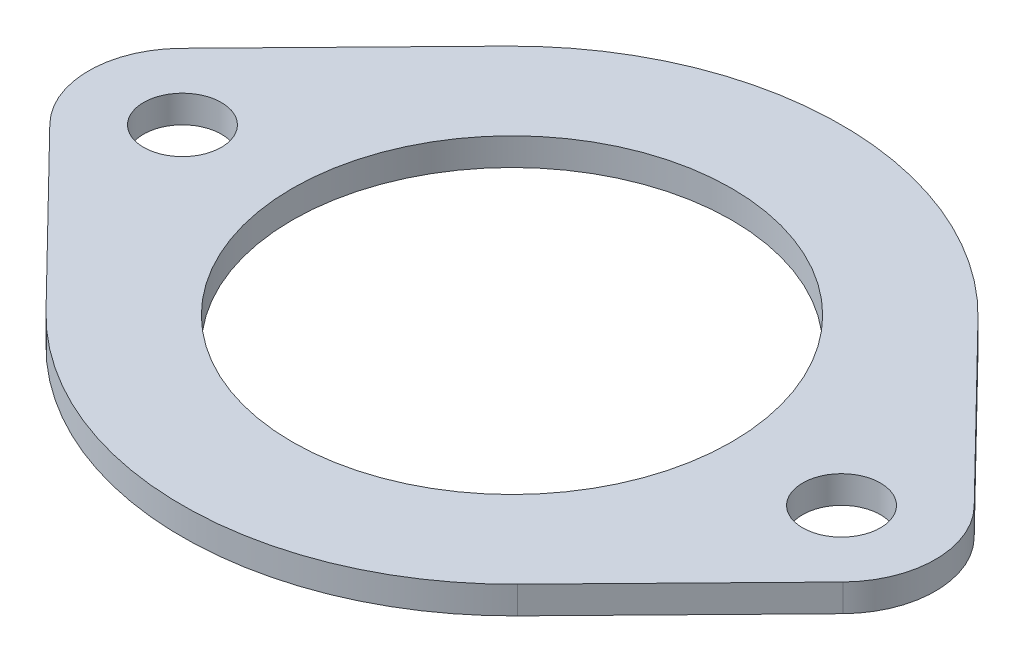
ISO-10303-21;
HEADER;
FILE_DESCRIPTION(('STEP AP214'),'2;1');
FILE_NAME('part.step','',(''),(''),'','','');
FILE_SCHEMA(('AUTOMOTIVE_DESIGN { 1 0 10303 214 1 1 1 1 }'));
ENDSEC;
DATA;
#1=APPLICATION_CONTEXT('core data for automotive mechanical design processes');
#2=APPLICATION_PROTOCOL_DEFINITION('international standard','automotive_design',2000,#1);
#3=PRODUCT_CONTEXT('',#1,'mechanical');
#4=PRODUCT('Part','Part','',(#3));
#5=PRODUCT_RELATED_PRODUCT_CATEGORY('part','',(#4));
#6=PRODUCT_DEFINITION_FORMATION('','',#4);
#7=PRODUCT_DEFINITION_CONTEXT('part definition',#1,'design');
#8=PRODUCT_DEFINITION('design','',#6,#7);
#9=PRODUCT_DEFINITION_SHAPE('','',#8);
#10=(LENGTH_UNIT() NAMED_UNIT(*) SI_UNIT(.MILLI.,.METRE.));
#11=(NAMED_UNIT(*) PLANE_ANGLE_UNIT() SI_UNIT($,.RADIAN.));
#12=(NAMED_UNIT(*) SI_UNIT($,.STERADIAN.) SOLID_ANGLE_UNIT());
#13=UNCERTAINTY_MEASURE_WITH_UNIT(LENGTH_MEASURE(1.E-05),#10,'distance_accuracy_value','');
#14=(GEOMETRIC_REPRESENTATION_CONTEXT(3) GLOBAL_UNCERTAINTY_ASSIGNED_CONTEXT((#13)) GLOBAL_UNIT_ASSIGNED_CONTEXT((#10,
#11,#12)) REPRESENTATION_CONTEXT('',''));
#15=CARTESIAN_POINT('',(0.,0.,0.));
#16=DIRECTION('',(0.,0.,1.));
#17=DIRECTION('',(1.,0.,0.));
#18=AXIS2_PLACEMENT_3D('',#15,#16,#17);
#19=CARTESIAN_POINT('',(-19.05,1.5875,0.));
#20=DIRECTION('',(0.,1.,0.));
#21=DIRECTION('',(0.,0.,1.));
#22=AXIS2_PLACEMENT_3D('',#19,#20,#21);
#23=PLANE('',#22);
#24=CARTESIAN_POINT('',(-19.05,1.5875,0.));
#25=DIRECTION('',(0.,1.,0.));
#26=DIRECTION('',(0.,0.,1.));
#27=AXIS2_PLACEMENT_3D('',#24,#25,#26);
#28=CIRCLE('',#27,2.2479);
#29=CARTESIAN_POINT('',(-19.05,1.5875,2.2479));
#30=VERTEX_POINT('',#29);
#31=EDGE_CURVE('E136',#30,#30,#28,.T.);
#32=ORIENTED_EDGE('',*,*,#31,.F.);
#33=EDGE_LOOP('',(#32));
#34=FACE_BOUND('',#33,.T.);
#35=CARTESIAN_POINT('',(-19.05,1.5875,0.));
#36=DIRECTION('',(0.,1.,0.));
#37=DIRECTION('',(0.,0.,1.));
#38=AXIS2_PLACEMENT_3D('',#35,#36,#37);
#39=CIRCLE('',#38,5.42289999999999);
#40=CARTESIAN_POINT('',(-22.9291811333333,1.5875,-3.78943243042947));
#41=VERTEX_POINT('',#40);
#42=CARTESIAN_POINT('',(-22.9291811333333,1.5875,3.78943243042948));
#43=VERTEX_POINT('',#42);
#44=EDGE_CURVE('E147',#41,#43,#39,.T.);
#45=ORIENTED_EDGE('',*,*,#44,.T.);
#46=DIRECTION('',(0.698783387196792,0.,0.715333333333334));
#47=VECTOR('',#46,1.);
#48=CARTESIAN_POINT('',(-22.9291811333333,1.5875,3.78943243042948));
#49=LINE('',#48,#47);
#50=CARTESIAN_POINT('',(-13.6271,1.5875,13.3118235260989));
#51=VERTEX_POINT('',#50);
#52=EDGE_CURVE('E95',#43,#51,#49,.T.);
#53=ORIENTED_EDGE('',*,*,#52,.T.);
#54=CARTESIAN_POINT('',(0.,1.5875,0.));
#55=DIRECTION('',(0.,1.,0.));
#56=DIRECTION('',(0.,0.,1.));
#57=AXIS2_PLACEMENT_3D('',#54,#55,#56);
#58=CIRCLE('',#57,19.05);
#59=CARTESIAN_POINT('',(13.6271,1.5875,13.3118235260989));
#60=VERTEX_POINT('',#59);
#61=EDGE_CURVE('E162',#51,#60,#58,.T.);
#62=ORIENTED_EDGE('',*,*,#61,.T.);
#63=DIRECTION('',(0.698783387196792,0.,-0.715333333333334));
#64=VECTOR('',#63,1.);
#65=CARTESIAN_POINT('',(22.9291811333333,1.5875,3.78943243042947));
#66=LINE('',#65,#64);
#67=CARTESIAN_POINT('',(22.9291811333333,1.5875,3.78943243042947));
#68=VERTEX_POINT('',#67);
#69=EDGE_CURVE('E175',#60,#68,#66,.T.);
#70=ORIENTED_EDGE('',*,*,#69,.T.);
#71=CARTESIAN_POINT('',(19.05,1.5875,0.));
#72=DIRECTION('',(0.,1.,0.));
#73=DIRECTION('',(0.,0.,1.));
#74=AXIS2_PLACEMENT_3D('',#71,#72,#73);
#75=CIRCLE('',#74,5.42289999999999);
#76=CARTESIAN_POINT('',(22.9291811333333,1.5875,-3.78943243042948));
#77=VERTEX_POINT('',#76);
#78=EDGE_CURVE('E114',#68,#77,#75,.T.);
#79=ORIENTED_EDGE('',*,*,#78,.T.);
#80=DIRECTION('',(-0.698783387196792,0.,-0.715333333333334));
#81=VECTOR('',#80,1.);
#82=CARTESIAN_POINT('',(22.9291811333333,1.5875,-3.78943243042948));
#83=LINE('',#82,#81);
#84=CARTESIAN_POINT('',(13.6271,1.5875,-13.3118235260989));
#85=VERTEX_POINT('',#84);
#86=EDGE_CURVE('E108',#77,#85,#83,.T.);
#87=ORIENTED_EDGE('',*,*,#86,.T.);
#88=CARTESIAN_POINT('',(0.,1.5875,0.));
#89=DIRECTION('',(0.,1.,0.));
#90=DIRECTION('',(0.,0.,1.));
#91=AXIS2_PLACEMENT_3D('',#88,#89,#90);
#92=CIRCLE('',#91,19.05);
#93=CARTESIAN_POINT('',(-13.6271,1.5875,-13.3118235260989));
#94=VERTEX_POINT('',#93);
#95=EDGE_CURVE('E112',#85,#94,#92,.T.);
#96=ORIENTED_EDGE('',*,*,#95,.T.);
#97=DIRECTION('',(-0.698783387196792,0.,0.715333333333334));
#98=VECTOR('',#97,1.);
#99=CARTESIAN_POINT('',(-22.9291811333333,1.5875,-3.78943243042947));
#100=LINE('',#99,#98);
#101=EDGE_CURVE('E52',#94,#41,#100,.T.);
#102=ORIENTED_EDGE('',*,*,#101,.T.);
#103=EDGE_LOOP('',(#45,#53,#62,#70,#79,#87,#96,#102));
#104=FACE_BOUND('',#103,.T.);
#105=CARTESIAN_POINT('',(19.05,1.5875,0.));
#106=DIRECTION('',(0.,1.,0.));
#107=DIRECTION('',(0.,0.,1.));
#108=AXIS2_PLACEMENT_3D('',#105,#106,#107);
#109=CIRCLE('',#108,2.2479);
#110=CARTESIAN_POINT('',(19.05,1.5875,2.2479));
#111=VERTEX_POINT('',#110);
#112=EDGE_CURVE('E184',#111,#111,#109,.T.);
#113=ORIENTED_EDGE('',*,*,#112,.F.);
#114=EDGE_LOOP('',(#113));
#115=FACE_BOUND('',#114,.T.);
#116=CARTESIAN_POINT('',(0.,1.5875,0.));
#117=DIRECTION('',(0.,-1.,0.));
#118=DIRECTION('',(0.,0.,-1.));
#119=AXIS2_PLACEMENT_3D('',#116,#117,#118);
#120=CIRCLE('',#119,12.7);
#121=CARTESIAN_POINT('',(0.,1.5875,-12.7));
#122=VERTEX_POINT('',#121);
#123=EDGE_CURVE('E190',#122,#122,#120,.T.);
#124=ORIENTED_EDGE('',*,*,#123,.T.);
#125=EDGE_LOOP('',(#124));
#126=FACE_BOUND('',#125,.T.);
#127=ADVANCED_FACE('F35',(#34,#104,#115,#126),#23,.T.);
#128=CARTESIAN_POINT('',(-19.05,0.,0.));
#129=DIRECTION('',(0.,1.,0.));
#130=DIRECTION('',(0.,0.,1.));
#131=AXIS2_PLACEMENT_3D('',#128,#129,#130);
#132=PLANE('',#131);
#133=CARTESIAN_POINT('',(-19.05,0.,0.));
#134=DIRECTION('',(0.,1.,0.));
#135=DIRECTION('',(0.,0.,1.));
#136=AXIS2_PLACEMENT_3D('',#133,#134,#135);
#137=CIRCLE('',#136,5.42289999999999);
#138=CARTESIAN_POINT('',(-22.9291811333333,0.,-3.78943243042947));
#139=VERTEX_POINT('',#138);
#140=CARTESIAN_POINT('',(-22.9291811333333,0.,3.78943243042948));
#141=VERTEX_POINT('',#140);
#142=EDGE_CURVE('E132',#139,#141,#137,.T.);
#143=ORIENTED_EDGE('',*,*,#142,.F.);
#144=DIRECTION('',(-0.698783387196792,0.,0.715333333333334));
#145=VECTOR('',#144,1.);
#146=CARTESIAN_POINT('',(-22.9291811333333,0.,-3.78943243042947));
#147=LINE('',#146,#145);
#148=CARTESIAN_POINT('',(-13.6271,0.,-13.3118235260989));
#149=VERTEX_POINT('',#148);
#150=EDGE_CURVE('E87',#149,#139,#147,.T.);
#151=ORIENTED_EDGE('',*,*,#150,.F.);
#152=CARTESIAN_POINT('',(0.,0.,0.));
#153=DIRECTION('',(0.,1.,0.));
#154=DIRECTION('',(0.,0.,1.));
#155=AXIS2_PLACEMENT_3D('',#152,#153,#154);
#156=CIRCLE('',#155,19.05);
#157=CARTESIAN_POINT('',(13.6271,0.,-13.3118235260989));
#158=VERTEX_POINT('',#157);
#159=EDGE_CURVE('E81',#158,#149,#156,.T.);
#160=ORIENTED_EDGE('',*,*,#159,.F.);
#161=DIRECTION('',(-0.698783387196792,0.,-0.715333333333334));
#162=VECTOR('',#161,1.);
#163=CARTESIAN_POINT('',(22.9291811333333,0.,-3.78943243042948));
#164=LINE('',#163,#162);
#165=CARTESIAN_POINT('',(22.9291811333333,0.,-3.78943243042948));
#166=VERTEX_POINT('',#165);
#167=EDGE_CURVE('E122',#166,#158,#164,.T.);
#168=ORIENTED_EDGE('',*,*,#167,.F.);
#169=CARTESIAN_POINT('',(19.05,0.,0.));
#170=DIRECTION('',(0.,1.,0.));
#171=DIRECTION('',(0.,0.,1.));
#172=AXIS2_PLACEMENT_3D('',#169,#170,#171);
#173=CIRCLE('',#172,5.42289999999999);
#174=CARTESIAN_POINT('',(22.9291811333333,0.,3.78943243042947));
#175=VERTEX_POINT('',#174);
#176=EDGE_CURVE('E142',#175,#166,#173,.T.);
#177=ORIENTED_EDGE('',*,*,#176,.F.);
#178=DIRECTION('',(0.698783387196792,0.,-0.715333333333334));
#179=VECTOR('',#178,1.);
#180=CARTESIAN_POINT('',(22.9291811333333,0.,3.78943243042947));
#181=LINE('',#180,#179);
#182=CARTESIAN_POINT('',(13.6271,0.,13.3118235260989));
#183=VERTEX_POINT('',#182);
#184=EDGE_CURVE('E140',#183,#175,#181,.T.);
#185=ORIENTED_EDGE('',*,*,#184,.F.);
#186=CARTESIAN_POINT('',(0.,0.,0.));
#187=DIRECTION('',(0.,1.,0.));
#188=DIRECTION('',(0.,0.,1.));
#189=AXIS2_PLACEMENT_3D('',#186,#187,#188);
#190=CIRCLE('',#189,19.05);
#191=CARTESIAN_POINT('',(-13.6271,0.,13.3118235260989));
#192=VERTEX_POINT('',#191);
#193=EDGE_CURVE('E138',#192,#183,#190,.T.);
#194=ORIENTED_EDGE('',*,*,#193,.F.);
#195=DIRECTION('',(0.698783387196792,0.,0.715333333333334));
#196=VECTOR('',#195,1.);
#197=CARTESIAN_POINT('',(-22.9291811333333,0.,3.78943243042948));
#198=LINE('',#197,#196);
#199=EDGE_CURVE('E135',#141,#192,#198,.T.);
#200=ORIENTED_EDGE('',*,*,#199,.F.);
#201=EDGE_LOOP('',(#143,#151,#160,#168,#177,#185,#194,#200));
#202=FACE_BOUND('',#201,.T.);
#203=CARTESIAN_POINT('',(-19.05,0.,0.));
#204=DIRECTION('',(0.,1.,0.));
#205=DIRECTION('',(0.,0.,1.));
#206=AXIS2_PLACEMENT_3D('',#203,#204,#205);
#207=CIRCLE('',#206,2.2479);
#208=CARTESIAN_POINT('',(-19.05,0.,2.2479));
#209=VERTEX_POINT('',#208);
#210=EDGE_CURVE('E181',#209,#209,#207,.T.);
#211=ORIENTED_EDGE('',*,*,#210,.T.);
#212=EDGE_LOOP('',(#211));
#213=FACE_BOUND('',#212,.T.);
#214=CARTESIAN_POINT('',(19.05,0.,0.));
#215=DIRECTION('',(0.,1.,0.));
#216=DIRECTION('',(0.,0.,1.));
#217=AXIS2_PLACEMENT_3D('',#214,#215,#216);
#218=CIRCLE('',#217,2.2479);
#219=CARTESIAN_POINT('',(19.05,0.,2.2479));
#220=VERTEX_POINT('',#219);
#221=EDGE_CURVE('E187',#220,#220,#218,.T.);
#222=ORIENTED_EDGE('',*,*,#221,.T.);
#223=EDGE_LOOP('',(#222));
#224=FACE_BOUND('',#223,.T.);
#225=CARTESIAN_POINT('',(0.,0.,0.));
#226=DIRECTION('',(0.,-1.,0.));
#227=DIRECTION('',(0.,0.,-1.));
#228=AXIS2_PLACEMENT_3D('',#225,#226,#227);
#229=CIRCLE('',#228,12.7);
#230=CARTESIAN_POINT('',(0.,0.,-12.7));
#231=VERTEX_POINT('',#230);
#232=EDGE_CURVE('E193',#231,#231,#229,.T.);
#233=ORIENTED_EDGE('',*,*,#232,.F.);
#234=EDGE_LOOP('',(#233));
#235=FACE_BOUND('',#234,.T.);
#236=ADVANCED_FACE('F166',(#202,#213,#224,#235),#132,.F.);
#237=CARTESIAN_POINT('',(-19.05,1.5875,0.));
#238=DIRECTION('',(0.,-1.,0.));
#239=DIRECTION('',(0.,0.,-1.));
#240=AXIS2_PLACEMENT_3D('',#237,#238,#239);
#241=CYLINDRICAL_SURFACE('',#240,5.42289999999999);
#242=ORIENTED_EDGE('',*,*,#142,.T.);
#243=DIRECTION('',(0.,-1.,0.));
#244=VECTOR('',#243,1.);
#245=CARTESIAN_POINT('',(-22.9291811333333,1.5875,3.78943243042948));
#246=LINE('',#245,#244);
#247=EDGE_CURVE('E11',#43,#141,#246,.T.);
#248=ORIENTED_EDGE('',*,*,#247,.F.);
#249=ORIENTED_EDGE('',*,*,#44,.F.);
#250=DIRECTION('',(0.,-1.,0.));
#251=VECTOR('',#250,1.);
#252=CARTESIAN_POINT('',(-22.9291811333333,1.5875,-3.78943243042947));
#253=LINE('',#252,#251);
#254=EDGE_CURVE('E128',#41,#139,#253,.T.);
#255=ORIENTED_EDGE('',*,*,#254,.T.);
#256=EDGE_LOOP('',(#242,#248,#249,#255));
#257=FACE_BOUND('',#256,.T.);
#258=ADVANCED_FACE('F37',(#257),#241,.T.);
#259=CARTESIAN_POINT('',(-22.9291811333333,1.5875,3.78943243042948));
#260=DIRECTION('',(0.715333333333334,0.,-0.698783387196792));
#261=DIRECTION('',(-0.698783387196792,0.,-0.715333333333334));
#262=AXIS2_PLACEMENT_3D('',#259,#260,#261);
#263=PLANE('',#262);
#264=ORIENTED_EDGE('',*,*,#199,.T.);
#265=DIRECTION('',(0.,-1.,0.));
#266=VECTOR('',#265,1.);
#267=CARTESIAN_POINT('',(-13.6271,1.5875,13.3118235260989));
#268=LINE('',#267,#266);
#269=EDGE_CURVE('E44',#51,#192,#268,.T.);
#270=ORIENTED_EDGE('',*,*,#269,.F.);
#271=ORIENTED_EDGE('',*,*,#52,.F.);
#272=ORIENTED_EDGE('',*,*,#247,.T.);
#273=EDGE_LOOP('',(#264,#270,#271,#272));
#274=FACE_BOUND('',#273,.T.);
#275=ADVANCED_FACE('F213',(#274),#263,.F.);
#276=CARTESIAN_POINT('',(0.,1.5875,0.));
#277=DIRECTION('',(0.,-1.,0.));
#278=DIRECTION('',(0.,0.,-1.));
#279=AXIS2_PLACEMENT_3D('',#276,#277,#278);
#280=CYLINDRICAL_SURFACE('',#279,19.05);
#281=ORIENTED_EDGE('',*,*,#193,.T.);
#282=DIRECTION('',(0.,-1.,0.));
#283=VECTOR('',#282,1.);
#284=CARTESIAN_POINT('',(13.6271,1.5875,13.3118235260989));
#285=LINE('',#284,#283);
#286=EDGE_CURVE('E154',#60,#183,#285,.T.);
#287=ORIENTED_EDGE('',*,*,#286,.F.);
#288=ORIENTED_EDGE('',*,*,#61,.F.);
#289=ORIENTED_EDGE('',*,*,#269,.T.);
#290=EDGE_LOOP('',(#281,#287,#288,#289));
#291=FACE_BOUND('',#290,.T.);
#292=ADVANCED_FACE('F160',(#291),#280,.T.);
#293=CARTESIAN_POINT('',(22.9291811333333,1.5875,3.78943243042947));
#294=DIRECTION('',(-0.715333333333334,0.,-0.698783387196792));
#295=DIRECTION('',(-0.698783387196792,0.,0.715333333333334));
#296=AXIS2_PLACEMENT_3D('',#293,#294,#295);
#297=PLANE('',#296);
#298=ORIENTED_EDGE('',*,*,#184,.T.);
#299=DIRECTION('',(0.,-1.,0.));
#300=VECTOR('',#299,1.);
#301=CARTESIAN_POINT('',(22.9291811333333,1.5875,3.78943243042947));
#302=LINE('',#301,#300);
#303=EDGE_CURVE('E151',#68,#175,#302,.T.);
#304=ORIENTED_EDGE('',*,*,#303,.F.);
#305=ORIENTED_EDGE('',*,*,#69,.F.);
#306=ORIENTED_EDGE('',*,*,#286,.T.);
#307=EDGE_LOOP('',(#298,#304,#305,#306));
#308=FACE_BOUND('',#307,.T.);
#309=ADVANCED_FACE('F171',(#308),#297,.F.);
#310=CARTESIAN_POINT('',(19.05,1.5875,0.));
#311=DIRECTION('',(0.,-1.,0.));
#312=DIRECTION('',(0.,0.,-1.));
#313=AXIS2_PLACEMENT_3D('',#310,#311,#312);
#314=CYLINDRICAL_SURFACE('',#313,5.42289999999999);
#315=ORIENTED_EDGE('',*,*,#176,.T.);
#316=DIRECTION('',(0.,-1.,0.));
#317=VECTOR('',#316,1.);
#318=CARTESIAN_POINT('',(22.9291811333333,1.5875,-3.78943243042948));
#319=LINE('',#318,#317);
#320=EDGE_CURVE('E123',#77,#166,#319,.T.);
#321=ORIENTED_EDGE('',*,*,#320,.F.);
#322=ORIENTED_EDGE('',*,*,#78,.F.);
#323=ORIENTED_EDGE('',*,*,#303,.T.);
#324=EDGE_LOOP('',(#315,#321,#322,#323));
#325=FACE_BOUND('',#324,.T.);
#326=ADVANCED_FACE('F174',(#325),#314,.T.);
#327=CARTESIAN_POINT('',(22.9291811333333,1.5875,-3.78943243042948));
#328=DIRECTION('',(-0.715333333333334,0.,0.698783387196792));
#329=DIRECTION('',(0.698783387196792,0.,0.715333333333334));
#330=AXIS2_PLACEMENT_3D('',#327,#328,#329);
#331=PLANE('',#330);
#332=ORIENTED_EDGE('',*,*,#167,.T.);
#333=DIRECTION('',(0.,-1.,0.));
#334=VECTOR('',#333,1.);
#335=CARTESIAN_POINT('',(13.6271,1.5875,-13.3118235260989));
#336=LINE('',#335,#334);
#337=EDGE_CURVE('E119',#85,#158,#336,.T.);
#338=ORIENTED_EDGE('',*,*,#337,.F.);
#339=ORIENTED_EDGE('',*,*,#86,.F.);
#340=ORIENTED_EDGE('',*,*,#320,.T.);
#341=EDGE_LOOP('',(#332,#338,#339,#340));
#342=FACE_BOUND('',#341,.T.);
#343=ADVANCED_FACE('F120',(#342),#331,.F.);
#344=CARTESIAN_POINT('',(0.,1.5875,0.));
#345=DIRECTION('',(0.,-1.,0.));
#346=DIRECTION('',(0.,0.,-1.));
#347=AXIS2_PLACEMENT_3D('',#344,#345,#346);
#348=CYLINDRICAL_SURFACE('',#347,19.05);
#349=ORIENTED_EDGE('',*,*,#159,.T.);
#350=DIRECTION('',(0.,-1.,0.));
#351=VECTOR('',#350,1.);
#352=CARTESIAN_POINT('',(-13.6271,1.5875,-13.3118235260989));
#353=LINE('',#352,#351);
#354=EDGE_CURVE('E124',#94,#149,#353,.T.);
#355=ORIENTED_EDGE('',*,*,#354,.F.);
#356=ORIENTED_EDGE('',*,*,#95,.F.);
#357=ORIENTED_EDGE('',*,*,#337,.T.);
#358=EDGE_LOOP('',(#349,#355,#356,#357));
#359=FACE_BOUND('',#358,.T.);
#360=ADVANCED_FACE('F126',(#359),#348,.T.);
#361=CARTESIAN_POINT('',(-22.9291811333333,1.5875,-3.78943243042947));
#362=DIRECTION('',(0.715333333333334,0.,0.698783387196792));
#363=DIRECTION('',(0.698783387196792,0.,-0.715333333333334));
#364=AXIS2_PLACEMENT_3D('',#361,#362,#363);
#365=PLANE('',#364);
#366=ORIENTED_EDGE('',*,*,#150,.T.);
#367=ORIENTED_EDGE('',*,*,#254,.F.);
#368=ORIENTED_EDGE('',*,*,#101,.F.);
#369=ORIENTED_EDGE('',*,*,#354,.T.);
#370=EDGE_LOOP('',(#366,#367,#368,#369));
#371=FACE_BOUND('',#370,.T.);
#372=ADVANCED_FACE('F219',(#371),#365,.F.);
#373=CARTESIAN_POINT('',(-19.05,1.5875,0.));
#374=DIRECTION('',(0.,-1.,0.));
#375=DIRECTION('',(0.,0.,-1.));
#376=AXIS2_PLACEMENT_3D('',#373,#374,#375);
#377=CYLINDRICAL_SURFACE('',#376,2.2479);
#378=ORIENTED_EDGE('',*,*,#31,.T.);
#379=EDGE_LOOP('',(#378));
#380=FACE_BOUND('',#379,.T.);
#381=ORIENTED_EDGE('',*,*,#210,.F.);
#382=EDGE_LOOP('',(#381));
#383=FACE_BOUND('',#382,.T.);
#384=ADVANCED_FACE('F222',(#380,#383),#377,.F.);
#385=CARTESIAN_POINT('',(19.05,1.5875,0.));
#386=DIRECTION('',(0.,-1.,0.));
#387=DIRECTION('',(0.,0.,-1.));
#388=AXIS2_PLACEMENT_3D('',#385,#386,#387);
#389=CYLINDRICAL_SURFACE('',#388,2.2479);
#390=ORIENTED_EDGE('',*,*,#112,.T.);
#391=EDGE_LOOP('',(#390));
#392=FACE_BOUND('',#391,.T.);
#393=ORIENTED_EDGE('',*,*,#221,.F.);
#394=EDGE_LOOP('',(#393));
#395=FACE_BOUND('',#394,.T.);
#396=ADVANCED_FACE('F203',(#392,#395),#389,.F.);
#397=CARTESIAN_POINT('',(0.,1.5875,0.));
#398=DIRECTION('',(0.,-1.,0.));
#399=DIRECTION('',(0.,0.,-1.));
#400=AXIS2_PLACEMENT_3D('',#397,#398,#399);
#401=CYLINDRICAL_SURFACE('',#400,12.7);
#402=ORIENTED_EDGE('',*,*,#123,.F.);
#403=EDGE_LOOP('',(#402));
#404=FACE_BOUND('',#403,.T.);
#405=ORIENTED_EDGE('',*,*,#232,.T.);
#406=EDGE_LOOP('',(#405));
#407=FACE_BOUND('',#406,.T.);
#408=ADVANCED_FACE('F200',(#404,#407),#401,.F.);
#409=CLOSED_SHELL('',(#127,#236,#258,#275,#292,#309,#326,#343,#360,#372,#384,#396,#408));
#410=MANIFOLD_SOLID_BREP('B2',#409);
#411=ADVANCED_BREP_SHAPE_REPRESENTATION('',(#18,#410),#14);
#412=SHAPE_DEFINITION_REPRESENTATION(#9,#411);
ENDSEC;
END-ISO-10303-21;
